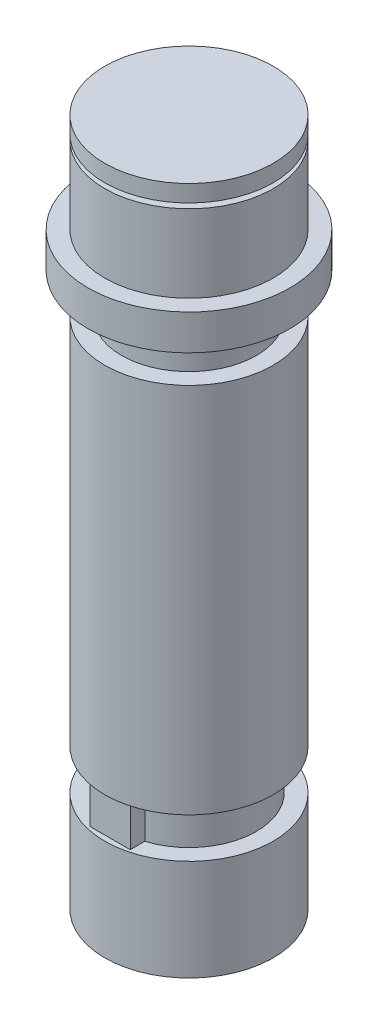
ISO-10303-21;
HEADER;
FILE_DESCRIPTION(('STEP AP214'),'2;1');
FILE_NAME('part.step','',(''),(''),'','','');
FILE_SCHEMA(('AUTOMOTIVE_DESIGN { 1 0 10303 214 1 1 1 1 }'));
ENDSEC;
DATA;
#1=APPLICATION_CONTEXT('core data for automotive mechanical design processes');
#2=APPLICATION_PROTOCOL_DEFINITION('international standard','automotive_design',2000,#1);
#3=PRODUCT_CONTEXT('',#1,'mechanical');
#4=PRODUCT('Part','Part','',(#3));
#5=PRODUCT_RELATED_PRODUCT_CATEGORY('part','',(#4));
#6=PRODUCT_DEFINITION_FORMATION('','',#4);
#7=PRODUCT_DEFINITION_CONTEXT('part definition',#1,'design');
#8=PRODUCT_DEFINITION('design','',#6,#7);
#9=PRODUCT_DEFINITION_SHAPE('','',#8);
#10=(LENGTH_UNIT() NAMED_UNIT(*) SI_UNIT(.MILLI.,.METRE.));
#11=(NAMED_UNIT(*) PLANE_ANGLE_UNIT() SI_UNIT($,.RADIAN.));
#12=(NAMED_UNIT(*) SI_UNIT($,.STERADIAN.) SOLID_ANGLE_UNIT());
#13=UNCERTAINTY_MEASURE_WITH_UNIT(LENGTH_MEASURE(1.E-05),#10,'distance_accuracy_value','');
#14=(GEOMETRIC_REPRESENTATION_CONTEXT(3) GLOBAL_UNCERTAINTY_ASSIGNED_CONTEXT((#13)) GLOBAL_UNIT_ASSIGNED_CONTEXT((#10,
#11,#12)) REPRESENTATION_CONTEXT('',''));
#15=CARTESIAN_POINT('',(0.,0.,0.));
#16=DIRECTION('',(0.,0.,1.));
#17=DIRECTION('',(1.,0.,0.));
#18=AXIS2_PLACEMENT_3D('',#15,#16,#17);
#19=CARTESIAN_POINT('',(0.,11.938,0.));
#20=DIRECTION('',(0.,-1.,0.));
#21=DIRECTION('',(0.,0.,-1.));
#22=AXIS2_PLACEMENT_3D('',#19,#20,#21);
#23=CYLINDRICAL_SURFACE('',#22,20.);
#24=DIRECTION('',(0.,-1.,0.));
#25=VECTOR('',#24,1.);
#26=CARTESIAN_POINT('',(-5.969,11.938,19.0885054155636));
#27=LINE('',#26,#25);
#28=CARTESIAN_POINT('',(-5.96900000000001,11.938,19.0885054155636));
#29=VERTEX_POINT('',#28);
#30=CARTESIAN_POINT('',(-5.96900000000001,0.,19.0885054155636));
#31=VERTEX_POINT('',#30);
#32=EDGE_CURVE('E74',#29,#31,#27,.T.);
#33=ORIENTED_EDGE('',*,*,#32,.F.);
#34=CARTESIAN_POINT('',(0.,11.938,0.));
#35=DIRECTION('',(0.,1.,0.));
#36=DIRECTION('',(0.,0.,1.));
#37=AXIS2_PLACEMENT_3D('',#34,#35,#36);
#38=CIRCLE('',#37,20.);
#39=CARTESIAN_POINT('',(5.969,11.938,19.0885054155636));
#40=VERTEX_POINT('',#39);
#41=EDGE_CURVE('E197',#40,#29,#38,.T.);
#42=ORIENTED_EDGE('',*,*,#41,.F.);
#43=DIRECTION('',(0.,-1.,0.));
#44=VECTOR('',#43,1.);
#45=CARTESIAN_POINT('',(5.969,11.938,19.0885054155636));
#46=LINE('',#45,#44);
#47=CARTESIAN_POINT('',(5.969,0.,19.0885054155636));
#48=VERTEX_POINT('',#47);
#49=EDGE_CURVE('E201',#48,#40,#46,.F.);
#50=ORIENTED_EDGE('',*,*,#49,.F.);
#51=CARTESIAN_POINT('',(0.,0.,0.));
#52=DIRECTION('',(0.,1.,0.));
#53=DIRECTION('',(0.,0.,1.));
#54=AXIS2_PLACEMENT_3D('',#51,#52,#53);
#55=CIRCLE('',#54,20.);
#56=EDGE_CURVE('E96',#48,#31,#55,.T.);
#57=ORIENTED_EDGE('',*,*,#56,.T.);
#58=EDGE_LOOP('',(#33,#42,#50,#57));
#59=FACE_BOUND('',#58,.T.);
#60=ADVANCED_FACE('F54',(#59),#23,.T.);
#61=CARTESIAN_POINT('',(-5.969,11.938,23.4065054155636));
#62=DIRECTION('',(0.,0.,-1.));
#63=DIRECTION('',(-1.,0.,0.));
#64=AXIS2_PLACEMENT_3D('',#61,#62,#63);
#65=PLANE('',#64);
#66=DIRECTION('',(1.,0.,0.));
#67=VECTOR('',#66,1.);
#68=CARTESIAN_POINT('',(-5.969,0.,23.4065054155636));
#69=LINE('',#68,#67);
#70=CARTESIAN_POINT('',(-5.969,0.,23.4065054155636));
#71=VERTEX_POINT('',#70);
#72=CARTESIAN_POINT('',(5.969,0.,23.4065054155636));
#73=VERTEX_POINT('',#72);
#74=EDGE_CURVE('E93',#71,#73,#69,.T.);
#75=ORIENTED_EDGE('',*,*,#74,.T.);
#76=DIRECTION('',(0.,-1.,0.));
#77=VECTOR('',#76,1.);
#78=CARTESIAN_POINT('',(5.969,11.938,23.4065054155636));
#79=LINE('',#78,#77);
#80=CARTESIAN_POINT('',(5.969,11.938,23.4065054155636));
#81=VERTEX_POINT('',#80);
#82=EDGE_CURVE('E220',#81,#73,#79,.T.);
#83=ORIENTED_EDGE('',*,*,#82,.F.);
#84=DIRECTION('',(1.,0.,0.));
#85=VECTOR('',#84,1.);
#86=CARTESIAN_POINT('',(-5.969,11.938,23.4065054155636));
#87=LINE('',#86,#85);
#88=CARTESIAN_POINT('',(-5.969,11.938,23.4065054155636));
#89=VERTEX_POINT('',#88);
#90=EDGE_CURVE('E86',#89,#81,#87,.T.);
#91=ORIENTED_EDGE('',*,*,#90,.F.);
#92=DIRECTION('',(0.,-1.,0.));
#93=VECTOR('',#92,1.);
#94=CARTESIAN_POINT('',(-5.969,11.938,23.4065054155636));
#95=LINE('',#94,#93);
#96=EDGE_CURVE('E204',#89,#71,#95,.T.);
#97=ORIENTED_EDGE('',*,*,#96,.T.);
#98=EDGE_LOOP('',(#75,#83,#91,#97));
#99=FACE_BOUND('',#98,.T.);
#100=ADVANCED_FACE('F231',(#99),#65,.F.);
#101=CARTESIAN_POINT('',(5.969,11.938,23.4065054155636));
#102=DIRECTION('',(-1.,0.,0.));
#103=DIRECTION('',(0.,0.,1.));
#104=AXIS2_PLACEMENT_3D('',#101,#102,#103);
#105=PLANE('',#104);
#106=DIRECTION('',(0.,0.,-1.));
#107=VECTOR('',#106,1.);
#108=CARTESIAN_POINT('',(5.969,0.,23.4065054155636));
#109=LINE('',#108,#107);
#110=EDGE_CURVE('E100',#73,#48,#109,.T.);
#111=ORIENTED_EDGE('',*,*,#110,.T.);
#112=ORIENTED_EDGE('',*,*,#49,.T.);
#113=DIRECTION('',(0.,0.,-1.));
#114=VECTOR('',#113,1.);
#115=CARTESIAN_POINT('',(5.969,11.938,23.4065054155636));
#116=LINE('',#115,#114);
#117=EDGE_CURVE('E216',#81,#40,#116,.T.);
#118=ORIENTED_EDGE('',*,*,#117,.F.);
#119=ORIENTED_EDGE('',*,*,#82,.T.);
#120=EDGE_LOOP('',(#111,#112,#118,#119));
#121=FACE_BOUND('',#120,.T.);
#122=ADVANCED_FACE('F245',(#121),#105,.F.);
#123=CARTESIAN_POINT('',(-5.969,11.938,19.0885054155636));
#124=DIRECTION('',(1.,0.,0.));
#125=DIRECTION('',(0.,0.,-1.));
#126=AXIS2_PLACEMENT_3D('',#123,#124,#125);
#127=PLANE('',#126);
#128=DIRECTION('',(0.,0.,1.));
#129=VECTOR('',#128,1.);
#130=CARTESIAN_POINT('',(-5.969,0.,19.0885054155636));
#131=LINE('',#130,#129);
#132=EDGE_CURVE('E193',#31,#71,#131,.T.);
#133=ORIENTED_EDGE('',*,*,#132,.T.);
#134=ORIENTED_EDGE('',*,*,#96,.F.);
#135=DIRECTION('',(0.,0.,1.));
#136=VECTOR('',#135,1.);
#137=CARTESIAN_POINT('',(-5.969,11.938,19.0885054155636));
#138=LINE('',#137,#136);
#139=EDGE_CURVE('E210',#29,#89,#138,.T.);
#140=ORIENTED_EDGE('',*,*,#139,.F.);
#141=ORIENTED_EDGE('',*,*,#32,.T.);
#142=EDGE_LOOP('',(#133,#134,#140,#141));
#143=FACE_BOUND('',#142,.T.);
#144=ADVANCED_FACE('F56',(#143),#127,.F.);
#145=CARTESIAN_POINT('',(0.,0.,0.));
#146=DIRECTION('',(0.,1.,0.));
#147=DIRECTION('',(0.,0.,1.));
#148=AXIS2_PLACEMENT_3D('',#145,#146,#147);
#149=PLANE('',#148);
#150=CARTESIAN_POINT('',(0.,0.,0.));
#151=DIRECTION('',(0.,1.,0.));
#152=DIRECTION('',(0.,0.,1.));
#153=AXIS2_PLACEMENT_3D('',#150,#151,#152);
#154=CIRCLE('',#153,25.);
#155=CARTESIAN_POINT('',(0.,0.,25.));
#156=VERTEX_POINT('',#155);
#157=EDGE_CURVE('E185',#156,#156,#154,.T.);
#158=ORIENTED_EDGE('',*,*,#157,.T.);
#159=EDGE_LOOP('',(#158));
#160=FACE_BOUND('',#159,.T.);
#161=ORIENTED_EDGE('',*,*,#56,.F.);
#162=ORIENTED_EDGE('',*,*,#110,.F.);
#163=ORIENTED_EDGE('',*,*,#74,.F.);
#164=ORIENTED_EDGE('',*,*,#132,.F.);
#165=EDGE_LOOP('',(#161,#162,#163,#164));
#166=FACE_BOUND('',#165,.T.);
#167=ADVANCED_FACE('F233',(#160,#166),#149,.T.);
#168=CARTESIAN_POINT('',(0.,-30.,0.));
#169=DIRECTION('',(0.,1.,0.));
#170=DIRECTION('',(0.,0.,1.));
#171=AXIS2_PLACEMENT_3D('',#168,#169,#170);
#172=CYLINDRICAL_SURFACE('',#171,25.);
#173=CARTESIAN_POINT('',(0.,-30.,0.));
#174=DIRECTION('',(0.,1.,0.));
#175=DIRECTION('',(0.,0.,1.));
#176=AXIS2_PLACEMENT_3D('',#173,#174,#175);
#177=CIRCLE('',#176,25.);
#178=CARTESIAN_POINT('',(0.,-30.,25.));
#179=VERTEX_POINT('',#178);
#180=EDGE_CURVE('E189',#179,#179,#177,.T.);
#181=ORIENTED_EDGE('',*,*,#180,.T.);
#182=EDGE_LOOP('',(#181));
#183=FACE_BOUND('',#182,.T.);
#184=ORIENTED_EDGE('',*,*,#157,.F.);
#185=EDGE_LOOP('',(#184));
#186=FACE_BOUND('',#185,.T.);
#187=ADVANCED_FACE('F235',(#183,#186),#172,.T.);
#188=CARTESIAN_POINT('',(0.,-30.,0.));
#189=DIRECTION('',(0.,1.,0.));
#190=DIRECTION('',(0.,0.,1.));
#191=AXIS2_PLACEMENT_3D('',#188,#189,#190);
#192=PLANE('',#191);
#193=ORIENTED_EDGE('',*,*,#180,.F.);
#194=EDGE_LOOP('',(#193));
#195=FACE_BOUND('',#194,.T.);
#196=ADVANCED_FACE('F242',(#195),#192,.F.);
#197=CARTESIAN_POINT('',(0.,11.938,0.));
#198=DIRECTION('',(0.,1.,0.));
#199=DIRECTION('',(0.,0.,1.));
#200=AXIS2_PLACEMENT_3D('',#197,#198,#199);
#201=PLANE('',#200);
#202=CARTESIAN_POINT('',(0.,11.938,0.));
#203=DIRECTION('',(0.,1.,0.));
#204=DIRECTION('',(0.,0.,1.));
#205=AXIS2_PLACEMENT_3D('',#202,#203,#204);
#206=CIRCLE('',#205,25.);
#207=CARTESIAN_POINT('',(0.,11.938,25.));
#208=VERTEX_POINT('',#207);
#209=EDGE_CURVE('E143',#208,#208,#206,.T.);
#210=ORIENTED_EDGE('',*,*,#209,.F.);
#211=EDGE_LOOP('',(#210));
#212=FACE_BOUND('',#211,.T.);
#213=ORIENTED_EDGE('',*,*,#117,.T.);
#214=ORIENTED_EDGE('',*,*,#41,.T.);
#215=ORIENTED_EDGE('',*,*,#139,.T.);
#216=ORIENTED_EDGE('',*,*,#90,.T.);
#217=EDGE_LOOP('',(#213,#214,#215,#216));
#218=FACE_BOUND('',#217,.T.);
#219=ADVANCED_FACE('F259',(#212,#218),#201,.F.);
#220=CARTESIAN_POINT('',(0.,122.338,0.));
#221=DIRECTION('',(0.,-1.,0.));
#222=DIRECTION('',(0.,0.,-1.));
#223=AXIS2_PLACEMENT_3D('',#220,#221,#222);
#224=CYLINDRICAL_SURFACE('',#223,25.);
#225=CARTESIAN_POINT('',(0.,122.338,0.));
#226=DIRECTION('',(0.,1.,0.));
#227=DIRECTION('',(0.,0.,1.));
#228=AXIS2_PLACEMENT_3D('',#225,#226,#227);
#229=CIRCLE('',#228,25.);
#230=CARTESIAN_POINT('',(0.,122.338,25.));
#231=VERTEX_POINT('',#230);
#232=EDGE_CURVE('E181',#231,#231,#229,.T.);
#233=ORIENTED_EDGE('',*,*,#232,.F.);
#234=EDGE_LOOP('',(#233));
#235=FACE_BOUND('',#234,.T.);
#236=ORIENTED_EDGE('',*,*,#209,.T.);
#237=EDGE_LOOP('',(#236));
#238=FACE_BOUND('',#237,.T.);
#239=ADVANCED_FACE('F261',(#235,#238),#224,.T.);
#240=CARTESIAN_POINT('',(0.,122.338,0.));
#241=DIRECTION('',(0.,1.,0.));
#242=DIRECTION('',(0.,0.,1.));
#243=AXIS2_PLACEMENT_3D('',#240,#241,#242);
#244=PLANE('',#243);
#245=DIRECTION('',(0.,0.,1.));
#246=VECTOR('',#245,1.);
#247=CARTESIAN_POINT('',(-5.95,122.338,0.));
#248=LINE('',#247,#246);
#249=CARTESIAN_POINT('',(-5.95,122.338,-23.3944363624591));
#250=VERTEX_POINT('',#249);
#251=CARTESIAN_POINT('',(-5.95,122.338,-19.0944363624591));
#252=VERTEX_POINT('',#251);
#253=EDGE_CURVE('E144',#250,#252,#248,.T.);
#254=ORIENTED_EDGE('',*,*,#253,.F.);
#255=DIRECTION('',(-1.,0.,0.));
#256=VECTOR('',#255,1.);
#257=CARTESIAN_POINT('',(0.,122.338,-23.3944363624591));
#258=LINE('',#257,#256);
#259=CARTESIAN_POINT('',(5.95,122.338,-23.3944363624591));
#260=VERTEX_POINT('',#259);
#261=EDGE_CURVE('E58',#260,#250,#258,.T.);
#262=ORIENTED_EDGE('',*,*,#261,.F.);
#263=DIRECTION('',(0.,0.,-1.));
#264=VECTOR('',#263,1.);
#265=CARTESIAN_POINT('',(5.95000000000001,122.338,0.));
#266=LINE('',#265,#264);
#267=CARTESIAN_POINT('',(5.95,122.338,-19.0944363624591));
#268=VERTEX_POINT('',#267);
#269=EDGE_CURVE('E154',#268,#260,#266,.T.);
#270=ORIENTED_EDGE('',*,*,#269,.F.);
#271=CARTESIAN_POINT('',(0.,122.338,0.));
#272=DIRECTION('',(0.,1.,0.));
#273=DIRECTION('',(0.,0.,1.));
#274=AXIS2_PLACEMENT_3D('',#271,#272,#273);
#275=CIRCLE('',#274,20.);
#276=EDGE_CURVE('E178',#252,#268,#275,.T.);
#277=ORIENTED_EDGE('',*,*,#276,.F.);
#278=EDGE_LOOP('',(#254,#262,#270,#277));
#279=FACE_BOUND('',#278,.T.);
#280=ORIENTED_EDGE('',*,*,#232,.T.);
#281=EDGE_LOOP('',(#280));
#282=FACE_BOUND('',#281,.T.);
#283=ADVANCED_FACE('F268',(#279,#282),#244,.T.);
#284=CARTESIAN_POINT('',(0.,134.238,0.));
#285=DIRECTION('',(0.,-1.,0.));
#286=DIRECTION('',(0.,0.,-1.));
#287=AXIS2_PLACEMENT_3D('',#284,#285,#286);
#288=CYLINDRICAL_SURFACE('',#287,20.);
#289=CARTESIAN_POINT('',(0.,134.238,0.));
#290=DIRECTION('',(0.,1.,0.));
#291=DIRECTION('',(0.,0.,1.));
#292=AXIS2_PLACEMENT_3D('',#289,#290,#291);
#293=CIRCLE('',#292,20.);
#294=CARTESIAN_POINT('',(-5.95,134.238,-19.0944363624591));
#295=VERTEX_POINT('',#294);
#296=CARTESIAN_POINT('',(5.95,134.238,-19.0944363624591));
#297=VERTEX_POINT('',#296);
#298=EDGE_CURVE('E132',#295,#297,#293,.T.);
#299=ORIENTED_EDGE('',*,*,#298,.F.);
#300=DIRECTION('',(0.,1.,0.));
#301=VECTOR('',#300,1.);
#302=CARTESIAN_POINT('',(-5.95,121.338,-19.0944363624591));
#303=LINE('',#302,#301);
#304=EDGE_CURVE('E136',#252,#295,#303,.T.);
#305=ORIENTED_EDGE('',*,*,#304,.F.);
#306=ORIENTED_EDGE('',*,*,#276,.T.);
#307=DIRECTION('',(0.,1.,0.));
#308=VECTOR('',#307,1.);
#309=CARTESIAN_POINT('',(5.95,121.338,-19.0944363624591));
#310=LINE('',#309,#308);
#311=EDGE_CURVE('E138',#268,#297,#310,.T.);
#312=ORIENTED_EDGE('',*,*,#311,.T.);
#313=EDGE_LOOP('',(#299,#305,#306,#312));
#314=FACE_BOUND('',#313,.T.);
#315=ADVANCED_FACE('F134',(#314),#288,.T.);
#316=CARTESIAN_POINT('',(-5.95,121.338,-19.0944363624591));
#317=DIRECTION('',(-1.,0.,0.));
#318=DIRECTION('',(0.,0.,1.));
#319=AXIS2_PLACEMENT_3D('',#316,#317,#318);
#320=PLANE('',#319);
#321=DIRECTION('',(0.,1.,0.));
#322=VECTOR('',#321,1.);
#323=CARTESIAN_POINT('',(-5.95,121.338,-23.3944363624591));
#324=LINE('',#323,#322);
#325=CARTESIAN_POINT('',(-5.95,134.238,-23.3944363624591));
#326=VERTEX_POINT('',#325);
#327=EDGE_CURVE('E155',#250,#326,#324,.T.);
#328=ORIENTED_EDGE('',*,*,#327,.F.);
#329=ORIENTED_EDGE('',*,*,#253,.T.);
#330=ORIENTED_EDGE('',*,*,#304,.T.);
#331=DIRECTION('',(0.,0.,1.));
#332=VECTOR('',#331,1.);
#333=CARTESIAN_POINT('',(-5.95,134.238,-19.0944363624591));
#334=LINE('',#333,#332);
#335=EDGE_CURVE('E150',#326,#295,#334,.T.);
#336=ORIENTED_EDGE('',*,*,#335,.F.);
#337=EDGE_LOOP('',(#328,#329,#330,#336));
#338=FACE_BOUND('',#337,.T.);
#339=ADVANCED_FACE('F149',(#338),#320,.T.);
#340=CARTESIAN_POINT('',(-5.95,121.338,-23.3944363624591));
#341=DIRECTION('',(0.,0.,-1.));
#342=DIRECTION('',(-1.,0.,0.));
#343=AXIS2_PLACEMENT_3D('',#340,#341,#342);
#344=PLANE('',#343);
#345=DIRECTION('',(0.,1.,0.));
#346=VECTOR('',#345,1.);
#347=CARTESIAN_POINT('',(5.95,121.338,-23.3944363624591));
#348=LINE('',#347,#346);
#349=CARTESIAN_POINT('',(5.95,134.238,-23.3944363624591));
#350=VERTEX_POINT('',#349);
#351=EDGE_CURVE('E164',#260,#350,#348,.T.);
#352=ORIENTED_EDGE('',*,*,#351,.F.);
#353=ORIENTED_EDGE('',*,*,#261,.T.);
#354=ORIENTED_EDGE('',*,*,#327,.T.);
#355=DIRECTION('',(-1.,0.,0.));
#356=VECTOR('',#355,1.);
#357=CARTESIAN_POINT('',(-5.95,134.238,-23.3944363624591));
#358=LINE('',#357,#356);
#359=EDGE_CURVE('E159',#350,#326,#358,.T.);
#360=ORIENTED_EDGE('',*,*,#359,.F.);
#361=EDGE_LOOP('',(#352,#353,#354,#360));
#362=FACE_BOUND('',#361,.T.);
#363=ADVANCED_FACE('F282',(#362),#344,.T.);
#364=CARTESIAN_POINT('',(5.95,121.338,-23.3944363624591));
#365=DIRECTION('',(1.,0.,0.));
#366=DIRECTION('',(0.,0.,-1.));
#367=AXIS2_PLACEMENT_3D('',#364,#365,#366);
#368=PLANE('',#367);
#369=ORIENTED_EDGE('',*,*,#311,.F.);
#370=ORIENTED_EDGE('',*,*,#269,.T.);
#371=ORIENTED_EDGE('',*,*,#351,.T.);
#372=DIRECTION('',(0.,0.,-1.));
#373=VECTOR('',#372,1.);
#374=CARTESIAN_POINT('',(5.95,134.238,-23.3944363624591));
#375=LINE('',#374,#373);
#376=EDGE_CURVE('E166',#297,#350,#375,.T.);
#377=ORIENTED_EDGE('',*,*,#376,.F.);
#378=EDGE_LOOP('',(#369,#370,#371,#377));
#379=FACE_BOUND('',#378,.T.);
#380=ADVANCED_FACE('F279',(#379),#368,.T.);
#381=CARTESIAN_POINT('',(0.,134.238,0.));
#382=DIRECTION('',(0.,1.,0.));
#383=DIRECTION('',(0.,0.,1.));
#384=AXIS2_PLACEMENT_3D('',#381,#382,#383);
#385=PLANE('',#384);
#386=CARTESIAN_POINT('',(0.,134.238,0.));
#387=DIRECTION('',(0.,1.,0.));
#388=DIRECTION('',(0.,0.,1.));
#389=AXIS2_PLACEMENT_3D('',#386,#387,#388);
#390=CIRCLE('',#389,30.);
#391=CARTESIAN_POINT('',(0.,134.238,-30.));
#392=VERTEX_POINT('',#391);
#393=EDGE_CURVE('E355',#392,#392,#390,.T.);
#394=ORIENTED_EDGE('',*,*,#393,.F.);
#395=EDGE_LOOP('',(#394));
#396=FACE_BOUND('',#395,.T.);
#397=ORIENTED_EDGE('',*,*,#335,.T.);
#398=ORIENTED_EDGE('',*,*,#298,.T.);
#399=ORIENTED_EDGE('',*,*,#376,.T.);
#400=ORIENTED_EDGE('',*,*,#359,.T.);
#401=EDGE_LOOP('',(#397,#398,#399,#400));
#402=FACE_BOUND('',#401,.T.);
#403=ADVANCED_FACE('F157',(#396,#402),#385,.F.);
#404=CARTESIAN_POINT('',(0.,144.738,0.));
#405=DIRECTION('',(0.,-1.,0.));
#406=DIRECTION('',(0.,0.,-1.));
#407=AXIS2_PLACEMENT_3D('',#404,#405,#406);
#408=CYLINDRICAL_SURFACE('',#407,30.);
#409=CARTESIAN_POINT('',(0.,144.738,0.));
#410=DIRECTION('',(0.,1.,0.));
#411=DIRECTION('',(0.,0.,1.));
#412=AXIS2_PLACEMENT_3D('',#409,#410,#411);
#413=CIRCLE('',#412,30.);
#414=CARTESIAN_POINT('',(0.,144.738,-30.));
#415=VERTEX_POINT('',#414);
#416=EDGE_CURVE('E359',#415,#415,#413,.T.);
#417=CARTESIAN_POINT('',(0.,144.738,-30.));
#418=CARTESIAN_POINT('',(0.,144.628625,-30.));
#419=CARTESIAN_POINT('',(0.,144.51925,-30.));
#420=CARTESIAN_POINT('',(0.,144.3005,-30.));
#421=CARTESIAN_POINT('',(0.,144.191125,-30.));
#422=CARTESIAN_POINT('',(0.,143.972375,-30.));
#423=CARTESIAN_POINT('',(0.,143.863,-30.));
#424=CARTESIAN_POINT('',(0.,143.64425,-30.));
#425=CARTESIAN_POINT('',(0.,143.534875,-30.));
#426=CARTESIAN_POINT('',(0.,143.316125,-30.));
#427=CARTESIAN_POINT('',(0.,143.20675,-30.));
#428=CARTESIAN_POINT('',(0.,142.988,-30.));
#429=CARTESIAN_POINT('',(0.,142.878625,-30.));
#430=CARTESIAN_POINT('',(0.,142.659875,-30.));
#431=CARTESIAN_POINT('',(0.,142.5505,-30.));
#432=CARTESIAN_POINT('',(0.,142.33175,-30.));
#433=CARTESIAN_POINT('',(0.,142.222375,-30.));
#434=CARTESIAN_POINT('',(0.,142.003625,-30.));
#435=CARTESIAN_POINT('',(0.,141.89425,-30.));
#436=CARTESIAN_POINT('',(0.,141.6755,-30.));
#437=CARTESIAN_POINT('',(0.,141.566125,-30.));
#438=CARTESIAN_POINT('',(0.,141.347375,-30.));
#439=CARTESIAN_POINT('',(0.,141.238,-30.));
#440=CARTESIAN_POINT('',(0.,141.01925,-30.));
#441=CARTESIAN_POINT('',(0.,140.909875,-30.));
#442=CARTESIAN_POINT('',(0.,140.691125,-30.));
#443=CARTESIAN_POINT('',(0.,140.58175,-30.));
#444=CARTESIAN_POINT('',(0.,140.363,-30.));
#445=CARTESIAN_POINT('',(0.,140.253625,-30.));
#446=CARTESIAN_POINT('',(0.,140.034875,-30.));
#447=CARTESIAN_POINT('',(0.,139.9255,-30.));
#448=CARTESIAN_POINT('',(0.,139.70675,-30.));
#449=CARTESIAN_POINT('',(0.,139.597375,-30.));
#450=CARTESIAN_POINT('',(0.,139.378625,-30.));
#451=CARTESIAN_POINT('',(0.,139.26925,-30.));
#452=CARTESIAN_POINT('',(0.,139.0505,-30.));
#453=CARTESIAN_POINT('',(0.,138.941125,-30.));
#454=CARTESIAN_POINT('',(0.,138.722375,-30.));
#455=CARTESIAN_POINT('',(0.,138.613,-30.));
#456=CARTESIAN_POINT('',(0.,138.39425,-30.));
#457=CARTESIAN_POINT('',(0.,138.284875,-30.));
#458=CARTESIAN_POINT('',(0.,138.066125,-30.));
#459=CARTESIAN_POINT('',(0.,137.95675,-30.));
#460=CARTESIAN_POINT('',(0.,137.738,-30.));
#461=CARTESIAN_POINT('',(0.,137.628625,-30.));
#462=CARTESIAN_POINT('',(0.,137.409875,-30.));
#463=CARTESIAN_POINT('',(0.,137.3005,-30.));
#464=CARTESIAN_POINT('',(0.,137.08175,-30.));
#465=CARTESIAN_POINT('',(0.,136.972375,-30.));
#466=CARTESIAN_POINT('',(0.,136.753625,-30.));
#467=CARTESIAN_POINT('',(0.,136.64425,-30.));
#468=CARTESIAN_POINT('',(0.,136.4255,-30.));
#469=CARTESIAN_POINT('',(0.,136.316125,-30.));
#470=CARTESIAN_POINT('',(0.,136.097375,-30.));
#471=CARTESIAN_POINT('',(0.,135.988,-30.));
#472=CARTESIAN_POINT('',(0.,135.76925,-30.));
#473=CARTESIAN_POINT('',(0.,135.659875,-30.));
#474=CARTESIAN_POINT('',(0.,135.441125,-30.));
#475=CARTESIAN_POINT('',(0.,135.33175,-30.));
#476=CARTESIAN_POINT('',(0.,135.113,-30.));
#477=CARTESIAN_POINT('',(0.,135.003625,-30.));
#478=CARTESIAN_POINT('',(0.,134.784875,-30.));
#479=CARTESIAN_POINT('',(0.,134.6755,-30.));
#480=CARTESIAN_POINT('',(0.,134.45675,-30.));
#481=CARTESIAN_POINT('',(0.,134.347375,-30.));
#482=CARTESIAN_POINT('',(0.,134.238,-30.));
#483=B_SPLINE_CURVE_WITH_KNOTS('',3,(#417,#418,#419,#420,#421,#422,#423,#424,#425,#426,#427,
#428,#429,#430,#431,#432,#433,#434,#435,#436,#437,#438,#439,#440,#441,#442,#443,#444,#445,#446,
#447,#448,#449,#450,#451,#452,#453,#454,#455,#456,#457,#458,#459,#460,#461,#462,#463,#464,#465,
#466,#467,#468,#469,#470,#471,#472,#473,#474,#475,#476,#477,#478,#479,#480,#481,#482),
.UNSPECIFIED.,.F.,.F.,(4,2,2,2,2,2,2,2,2,2,2,2,2,2,2,2,2,2,2,2,2,2,2,2,2,2,2,2,2,2,2,2,4),(0.,
0.328124999999985,0.656249999999997,0.984374999999982,1.31249999999999,1.64062499999998,
1.96874999999999,2.29687499999998,2.62499999999999,2.953125,3.28124999999999,3.609375,
3.93749999999998,4.26562499999999,4.59374999999998,4.92187499999999,5.24999999999998,
5.57812499999999,5.90625,6.23437499999999,6.5625,6.89062499999998,7.21875,7.54687499999998,
7.87499999999999,8.20312499999998,8.53124999999999,8.859375,9.18749999999999,9.515625,
9.84374999999998,10.171875,10.5),.UNSPECIFIED.);
#484=EDGE_CURVE('BSEAM289',#415,#392,#483,.T.);
#485=ORIENTED_EDGE('',*,*,#416,.F.);
#486=ORIENTED_EDGE('',*,*,#393,.T.);
#487=ORIENTED_EDGE('',*,*,#484,.T.);
#488=ORIENTED_EDGE('',*,*,#484,.F.);
#489=EDGE_LOOP('',(#485,#487,#486,#488));
#490=FACE_BOUND('',#489,.T.);
#491=ADVANCED_FACE('F289',(#490),#408,.T.);
#492=CARTESIAN_POINT('',(0.,144.738,0.));
#493=DIRECTION('',(0.,1.,0.));
#494=DIRECTION('',(0.,0.,1.));
#495=AXIS2_PLACEMENT_3D('',#492,#493,#494);
#496=PLANE('',#495);
#497=CARTESIAN_POINT('',(0.,144.738,0.));
#498=DIRECTION('',(0.,1.,0.));
#499=DIRECTION('',(0.,0.,1.));
#500=AXIS2_PLACEMENT_3D('',#497,#498,#499);
#501=CIRCLE('',#500,25.);
#502=CARTESIAN_POINT('',(0.,144.738,25.));
#503=VERTEX_POINT('',#502);
#504=EDGE_CURVE('E65',#503,#503,#501,.T.);
#505=ORIENTED_EDGE('',*,*,#504,.F.);
#506=EDGE_LOOP('',(#505));
#507=FACE_BOUND('',#506,.T.);
#508=ORIENTED_EDGE('',*,*,#416,.T.);
#509=EDGE_LOOP('',(#508));
#510=FACE_BOUND('',#509,.T.);
#511=ADVANCED_FACE('F292',(#507,#510),#496,.T.);
#512=CARTESIAN_POINT('',(0.,167.738,0.));
#513=DIRECTION('',(0.,-1.,0.));
#514=DIRECTION('',(0.,0.,-1.));
#515=AXIS2_PLACEMENT_3D('',#512,#513,#514);
#516=CYLINDRICAL_SURFACE('',#515,25.);
#517=CARTESIAN_POINT('',(0.,167.738,0.));
#518=DIRECTION('',(0.,1.,0.));
#519=DIRECTION('',(0.,0.,1.));
#520=AXIS2_PLACEMENT_3D('',#517,#518,#519);
#521=CIRCLE('',#520,25.);
#522=CARTESIAN_POINT('',(0.,167.738,25.));
#523=VERTEX_POINT('',#522);
#524=EDGE_CURVE('E350',#523,#523,#521,.T.);
#525=ORIENTED_EDGE('',*,*,#524,.F.);
#526=EDGE_LOOP('',(#525));
#527=FACE_BOUND('',#526,.T.);
#528=ORIENTED_EDGE('',*,*,#504,.T.);
#529=EDGE_LOOP('',(#528));
#530=FACE_BOUND('',#529,.T.);
#531=ADVANCED_FACE('F299',(#527,#530),#516,.T.);
#532=CARTESIAN_POINT('',(0.,167.738,0.));
#533=DIRECTION('',(0.,1.,0.));
#534=DIRECTION('',(0.,0.,1.));
#535=AXIS2_PLACEMENT_3D('',#532,#533,#534);
#536=PLANE('',#535);
#537=CARTESIAN_POINT('',(0.,167.738,8.));
#538=DIRECTION('',(0.,1.,0.));
#539=DIRECTION('',(0.,0.,1.));
#540=AXIS2_PLACEMENT_3D('',#537,#538,#539);
#541=CIRCLE('',#540,5.);
#542=CARTESIAN_POINT('',(0.,167.738,13.));
#543=VERTEX_POINT('',#542);
#544=EDGE_CURVE('E333',#543,#543,#541,.T.);
#545=ORIENTED_EDGE('',*,*,#544,.F.);
#546=EDGE_LOOP('',(#545));
#547=FACE_BOUND('',#546,.T.);
#548=CARTESIAN_POINT('',(0.,167.738,-8.));
#549=DIRECTION('',(0.,1.,0.));
#550=DIRECTION('',(0.,0.,1.));
#551=AXIS2_PLACEMENT_3D('',#548,#549,#550);
#552=CIRCLE('',#551,5.);
#553=CARTESIAN_POINT('',(0.,167.738,-3.));
#554=VERTEX_POINT('',#553);
#555=EDGE_CURVE('E12',#554,#554,#552,.T.);
#556=ORIENTED_EDGE('',*,*,#555,.F.);
#557=EDGE_LOOP('',(#556));
#558=FACE_BOUND('',#557,.T.);
#559=ORIENTED_EDGE('',*,*,#524,.T.);
#560=EDGE_LOOP('',(#559));
#561=FACE_BOUND('',#560,.T.);
#562=ADVANCED_FACE('F303',(#547,#558,#561),#536,.T.);
#563=CARTESIAN_POINT('',(0.,169.238,-8.));
#564=DIRECTION('',(0.,-1.,0.));
#565=DIRECTION('',(0.,0.,-1.));
#566=AXIS2_PLACEMENT_3D('',#563,#564,#565);
#567=CYLINDRICAL_SURFACE('',#566,5.);
#568=CARTESIAN_POINT('',(0.,169.238,-8.));
#569=DIRECTION('',(0.,1.,0.));
#570=DIRECTION('',(0.,0.,1.));
#571=AXIS2_PLACEMENT_3D('',#568,#569,#570);
#572=CIRCLE('',#571,5.);
#573=CARTESIAN_POINT('',(0.,169.238,-3.));
#574=VERTEX_POINT('',#573);
#575=EDGE_CURVE('E346',#574,#574,#572,.T.);
#576=ORIENTED_EDGE('',*,*,#575,.F.);
#577=EDGE_LOOP('',(#576));
#578=FACE_BOUND('',#577,.T.);
#579=ORIENTED_EDGE('',*,*,#555,.T.);
#580=EDGE_LOOP('',(#579));
#581=FACE_BOUND('',#580,.T.);
#582=ADVANCED_FACE('F307',(#578,#581),#567,.T.);
#583=CARTESIAN_POINT('',(0.,169.238,8.));
#584=DIRECTION('',(0.,-1.,0.));
#585=DIRECTION('',(0.,0.,-1.));
#586=AXIS2_PLACEMENT_3D('',#583,#584,#585);
#587=CYLINDRICAL_SURFACE('',#586,5.);
#588=CARTESIAN_POINT('',(0.,169.238,8.));
#589=DIRECTION('',(0.,1.,0.));
#590=DIRECTION('',(0.,0.,1.));
#591=AXIS2_PLACEMENT_3D('',#588,#589,#590);
#592=CIRCLE('',#591,5.);
#593=CARTESIAN_POINT('',(0.,169.238,13.));
#594=VERTEX_POINT('',#593);
#595=EDGE_CURVE('E339',#594,#594,#592,.T.);
#596=ORIENTED_EDGE('',*,*,#595,.F.);
#597=EDGE_LOOP('',(#596));
#598=FACE_BOUND('',#597,.T.);
#599=ORIENTED_EDGE('',*,*,#544,.T.);
#600=EDGE_LOOP('',(#599));
#601=FACE_BOUND('',#600,.T.);
#602=ADVANCED_FACE('F311',(#598,#601),#587,.T.);
#603=CARTESIAN_POINT('',(0.,174.238,0.));
#604=DIRECTION('',(0.,-1.,0.));
#605=DIRECTION('',(0.,0.,-1.));
#606=AXIS2_PLACEMENT_3D('',#603,#604,#605);
#607=CYLINDRICAL_SURFACE('',#606,25.);
#608=CARTESIAN_POINT('',(0.,174.238,0.));
#609=DIRECTION('',(0.,1.,0.));
#610=DIRECTION('',(0.,0.,1.));
#611=AXIS2_PLACEMENT_3D('',#608,#609,#610);
#612=CIRCLE('',#611,25.);
#613=CARTESIAN_POINT('',(0.,174.238,25.));
#614=VERTEX_POINT('',#613);
#615=EDGE_CURVE('E331',#614,#614,#612,.T.);
#616=ORIENTED_EDGE('',*,*,#615,.F.);
#617=EDGE_LOOP('',(#616));
#618=FACE_BOUND('',#617,.T.);
#619=CARTESIAN_POINT('',(0.,169.238,0.));
#620=DIRECTION('',(0.,1.,0.));
#621=DIRECTION('',(0.,0.,1.));
#622=AXIS2_PLACEMENT_3D('',#619,#620,#621);
#623=CIRCLE('',#622,25.);
#624=CARTESIAN_POINT('',(0.,169.238,25.));
#625=VERTEX_POINT('',#624);
#626=EDGE_CURVE('E334',#625,#625,#623,.T.);
#627=ORIENTED_EDGE('',*,*,#626,.T.);
#628=EDGE_LOOP('',(#627));
#629=FACE_BOUND('',#628,.T.);
#630=ADVANCED_FACE('F315',(#618,#629),#607,.T.);
#631=CARTESIAN_POINT('',(0.,174.238,0.));
#632=DIRECTION('',(0.,1.,0.));
#633=DIRECTION('',(0.,0.,1.));
#634=AXIS2_PLACEMENT_3D('',#631,#632,#633);
#635=PLANE('',#634);
#636=ORIENTED_EDGE('',*,*,#615,.T.);
#637=EDGE_LOOP('',(#636));
#638=FACE_BOUND('',#637,.T.);
#639=ADVANCED_FACE('F319',(#638),#635,.T.);
#640=CARTESIAN_POINT('',(0.,169.238,0.));
#641=DIRECTION('',(0.,1.,0.));
#642=DIRECTION('',(0.,0.,1.));
#643=AXIS2_PLACEMENT_3D('',#640,#641,#642);
#644=PLANE('',#643);
#645=ORIENTED_EDGE('',*,*,#575,.T.);
#646=EDGE_LOOP('',(#645));
#647=FACE_BOUND('',#646,.T.);
#648=ORIENTED_EDGE('',*,*,#595,.T.);
#649=EDGE_LOOP('',(#648));
#650=FACE_BOUND('',#649,.T.);
#651=ORIENTED_EDGE('',*,*,#626,.F.);
#652=EDGE_LOOP('',(#651));
#653=FACE_BOUND('',#652,.T.);
#654=ADVANCED_FACE('F321',(#647,#650,#653),#644,.F.);
#655=CLOSED_SHELL('',(#60,#100,#122,#144,#167,#187,#196,#219,#239,#283,#315,#339,#363,#380,#403,
#491,#511,#531,#562,#582,#602,#630,#639,#654));
#656=MANIFOLD_SOLID_BREP('B2',#655);
#657=ADVANCED_BREP_SHAPE_REPRESENTATION('',(#18,#656),#14);
#658=SHAPE_DEFINITION_REPRESENTATION(#9,#657);
ENDSEC;
END-ISO-10303-21;
